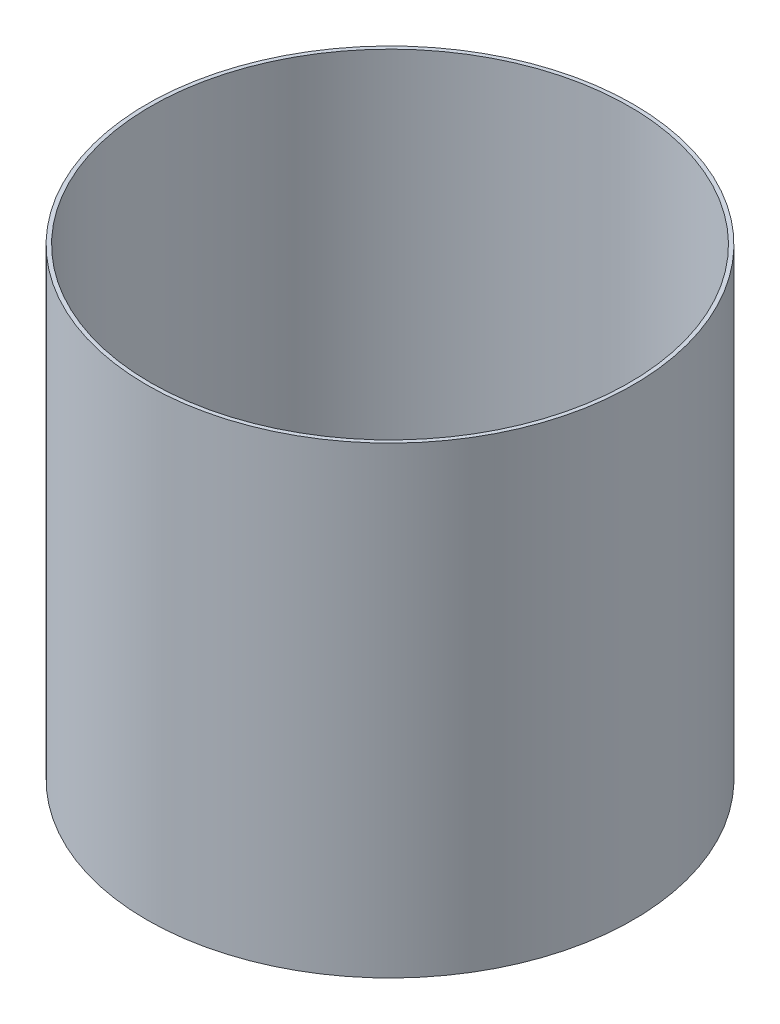
ISO-10303-21;
HEADER;
FILE_DESCRIPTION(('STEP AP214'),'2;1');
FILE_NAME('part.step','',(''),(''),'','','');
FILE_SCHEMA(('AUTOMOTIVE_DESIGN { 1 0 10303 214 1 1 1 1 }'));
ENDSEC;
DATA;
#1=APPLICATION_CONTEXT('core data for automotive mechanical design processes');
#2=APPLICATION_PROTOCOL_DEFINITION('international standard','automotive_design',2000,#1);
#3=PRODUCT_CONTEXT('',#1,'mechanical');
#4=PRODUCT('Part','Part','',(#3));
#5=PRODUCT_RELATED_PRODUCT_CATEGORY('part','',(#4));
#6=PRODUCT_DEFINITION_FORMATION('','',#4);
#7=PRODUCT_DEFINITION_CONTEXT('part definition',#1,'design');
#8=PRODUCT_DEFINITION('design','',#6,#7);
#9=PRODUCT_DEFINITION_SHAPE('','',#8);
#10=(LENGTH_UNIT() NAMED_UNIT(*) SI_UNIT(.MILLI.,.METRE.));
#11=(NAMED_UNIT(*) PLANE_ANGLE_UNIT() SI_UNIT($,.RADIAN.));
#12=(NAMED_UNIT(*) SI_UNIT($,.STERADIAN.) SOLID_ANGLE_UNIT());
#13=UNCERTAINTY_MEASURE_WITH_UNIT(LENGTH_MEASURE(1.E-05),#10,'distance_accuracy_value','');
#14=(GEOMETRIC_REPRESENTATION_CONTEXT(3) GLOBAL_UNCERTAINTY_ASSIGNED_CONTEXT((#13)) GLOBAL_UNIT_ASSIGNED_CONTEXT((#10,
#11,#12)) REPRESENTATION_CONTEXT('',''));
#15=CARTESIAN_POINT('',(0.,0.,0.));
#16=DIRECTION('',(0.,0.,1.));
#17=DIRECTION('',(1.,0.,0.));
#18=AXIS2_PLACEMENT_3D('',#15,#16,#17);
#19=CARTESIAN_POINT('',(0.,120.,0.));
#20=DIRECTION('',(0.,-1.,0.));
#21=DIRECTION('',(0.,0.,-1.));
#22=AXIS2_PLACEMENT_3D('',#19,#20,#21);
#23=CYLINDRICAL_SURFACE('',#22,63.);
#24=CARTESIAN_POINT('',(0.,120.,0.));
#25=DIRECTION('',(0.,1.,0.));
#26=DIRECTION('',(0.,0.,1.));
#27=AXIS2_PLACEMENT_3D('',#24,#25,#26);
#28=CIRCLE('',#27,63.);
#29=CARTESIAN_POINT('',(0.,120.,63.));
#30=VERTEX_POINT('',#29);
#31=EDGE_CURVE('E10',#30,#30,#28,.T.);
#32=ORIENTED_EDGE('',*,*,#31,.F.);
#33=EDGE_LOOP('',(#32));
#34=FACE_BOUND('',#33,.T.);
#35=CARTESIAN_POINT('',(0.,0.,0.));
#36=DIRECTION('',(0.,1.,0.));
#37=DIRECTION('',(0.,0.,1.));
#38=AXIS2_PLACEMENT_3D('',#35,#36,#37);
#39=CIRCLE('',#38,63.);
#40=CARTESIAN_POINT('',(0.,0.,63.));
#41=VERTEX_POINT('',#40);
#42=EDGE_CURVE('E34',#41,#41,#39,.T.);
#43=ORIENTED_EDGE('',*,*,#42,.T.);
#44=EDGE_LOOP('',(#43));
#45=FACE_BOUND('',#44,.T.);
#46=ADVANCED_FACE('F31',(#34,#45),#23,.T.);
#47=CARTESIAN_POINT('',(0.,120.,0.));
#48=DIRECTION('',(0.,1.,0.));
#49=DIRECTION('',(0.,0.,1.));
#50=AXIS2_PLACEMENT_3D('',#47,#48,#49);
#51=PLANE('',#50);
#52=CARTESIAN_POINT('',(0.,120.,0.));
#53=DIRECTION('',(0.,1.,0.));
#54=DIRECTION('',(0.,0.,1.));
#55=AXIS2_PLACEMENT_3D('',#52,#53,#54);
#56=CIRCLE('',#55,62.);
#57=CARTESIAN_POINT('',(0.,120.,62.));
#58=VERTEX_POINT('',#57);
#59=EDGE_CURVE('E41',#58,#58,#56,.T.);
#60=ORIENTED_EDGE('',*,*,#59,.F.);
#61=EDGE_LOOP('',(#60));
#62=FACE_BOUND('',#61,.T.);
#63=ORIENTED_EDGE('',*,*,#31,.T.);
#64=EDGE_LOOP('',(#63));
#65=FACE_BOUND('',#64,.T.);
#66=ADVANCED_FACE('F61',(#62,#65),#51,.T.);
#67=CARTESIAN_POINT('',(0.,0.,0.));
#68=DIRECTION('',(0.,1.,0.));
#69=DIRECTION('',(0.,0.,1.));
#70=AXIS2_PLACEMENT_3D('',#67,#68,#69);
#71=PLANE('',#70);
#72=ORIENTED_EDGE('',*,*,#42,.F.);
#73=EDGE_LOOP('',(#72));
#74=FACE_BOUND('',#73,.T.);
#75=ADVANCED_FACE('F53',(#74),#71,.F.);
#76=CARTESIAN_POINT('',(0.,120.,0.));
#77=DIRECTION('',(0.,-1.,0.));
#78=DIRECTION('',(0.,0.,-1.));
#79=AXIS2_PLACEMENT_3D('',#76,#77,#78);
#80=CYLINDRICAL_SURFACE('',#79,62.);
#81=ORIENTED_EDGE('',*,*,#59,.T.);
#82=EDGE_LOOP('',(#81));
#83=FACE_BOUND('',#82,.T.);
#84=CARTESIAN_POINT('',(0.,1.,0.));
#85=DIRECTION('',(0.,1.,0.));
#86=DIRECTION('',(0.,0.,1.));
#87=AXIS2_PLACEMENT_3D('',#84,#85,#86);
#88=CIRCLE('',#87,62.);
#89=CARTESIAN_POINT('',(0.,1.,62.));
#90=VERTEX_POINT('',#89);
#91=EDGE_CURVE('E45',#90,#90,#88,.T.);
#92=ORIENTED_EDGE('',*,*,#91,.F.);
#93=EDGE_LOOP('',(#92));
#94=FACE_BOUND('',#93,.T.);
#95=ADVANCED_FACE('F51',(#83,#94),#80,.F.);
#96=CARTESIAN_POINT('',(0.,1.,0.));
#97=DIRECTION('',(0.,1.,0.));
#98=DIRECTION('',(0.,0.,1.));
#99=AXIS2_PLACEMENT_3D('',#96,#97,#98);
#100=PLANE('',#99);
#101=ORIENTED_EDGE('',*,*,#91,.T.);
#102=EDGE_LOOP('',(#101));
#103=FACE_BOUND('',#102,.T.);
#104=ADVANCED_FACE('F49',(#103),#100,.T.);
#105=CLOSED_SHELL('',(#46,#66,#75,#95,#104));
#106=MANIFOLD_SOLID_BREP('B2',#105);
#107=ADVANCED_BREP_SHAPE_REPRESENTATION('',(#18,#106),#14);
#108=SHAPE_DEFINITION_REPRESENTATION(#9,#107);
ENDSEC;
END-ISO-10303-21;
